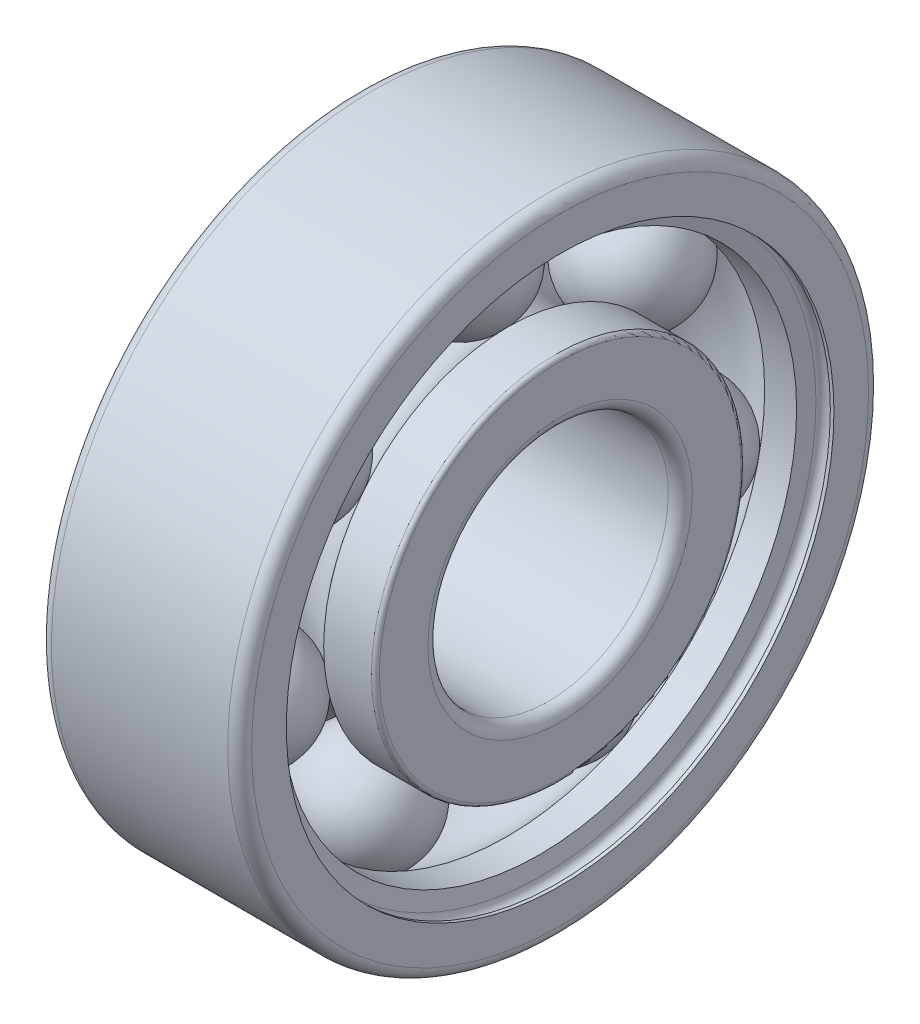
ISO-10303-21;
HEADER;
FILE_DESCRIPTION(('STEP AP214'),'2;1');
FILE_NAME('part.step','',(''),(''),'','','');
FILE_SCHEMA(('AUTOMOTIVE_DESIGN { 1 0 10303 214 1 1 1 1 }'));
ENDSEC;
DATA;
#1=APPLICATION_CONTEXT('core data for automotive mechanical design processes');
#2=APPLICATION_PROTOCOL_DEFINITION('international standard','automotive_design',2000,#1);
#3=PRODUCT_CONTEXT('',#1,'mechanical');
#4=PRODUCT('Part','Part','',(#3));
#5=PRODUCT_RELATED_PRODUCT_CATEGORY('part','',(#4));
#6=PRODUCT_DEFINITION_FORMATION('','',#4);
#7=PRODUCT_DEFINITION_CONTEXT('part definition',#1,'design');
#8=PRODUCT_DEFINITION('design','',#6,#7);
#9=PRODUCT_DEFINITION_SHAPE('','',#8);
#10=(LENGTH_UNIT() NAMED_UNIT(*) SI_UNIT(.MILLI.,.METRE.));
#11=(NAMED_UNIT(*) PLANE_ANGLE_UNIT() SI_UNIT($,.RADIAN.));
#12=(NAMED_UNIT(*) SI_UNIT($,.STERADIAN.) SOLID_ANGLE_UNIT());
#13=UNCERTAINTY_MEASURE_WITH_UNIT(LENGTH_MEASURE(1.E-05),#10,'distance_accuracy_value','');
#14=(GEOMETRIC_REPRESENTATION_CONTEXT(3) GLOBAL_UNCERTAINTY_ASSIGNED_CONTEXT((#13)) GLOBAL_UNIT_ASSIGNED_CONTEXT((#10,
#11,#12)) REPRESENTATION_CONTEXT('',''));
#15=CARTESIAN_POINT('',(0.,0.,0.));
#16=DIRECTION('',(0.,0.,1.));
#17=DIRECTION('',(1.,0.,0.));
#18=AXIS2_PLACEMENT_3D('',#15,#16,#17);
#19=CARTESIAN_POINT('',(0.,15.4000000000003,0.));
#20=DIRECTION('',(-1.,0.,0.));
#21=DIRECTION('',(0.,0.,1.));
#22=AXIS2_PLACEMENT_3D('',#19,#20,#21);
#23=PLANE('',#22);
#24=CARTESIAN_POINT('',(0.,0.,0.));
#25=DIRECTION('',(1.,0.,0.));
#26=DIRECTION('',(0.,0.,-1.));
#27=AXIS2_PLACEMENT_3D('',#24,#25,#26);
#28=CIRCLE('',#27,13.67);
#29=CARTESIAN_POINT('',(0.,0.,-13.67));
#30=VERTEX_POINT('',#29);
#31=EDGE_CURVE('P0_E10',#30,#30,#28,.T.);
#32=ORIENTED_EDGE('',*,*,#31,.T.);
#33=EDGE_LOOP('',(#32));
#34=FACE_BOUND('',#33,.T.);
#35=CARTESIAN_POINT('',(0.,0.,0.));
#36=DIRECTION('',(1.,0.,0.));
#37=DIRECTION('',(0.,0.,-1.));
#38=AXIS2_PLACEMENT_3D('',#35,#36,#37);
#39=CIRCLE('',#38,15.4);
#40=CARTESIAN_POINT('',(0.,0.,-15.4));
#41=VERTEX_POINT('',#40);
#42=EDGE_CURVE('P0_E60',#41,#41,#39,.T.);
#43=ORIENTED_EDGE('',*,*,#42,.F.);
#44=EDGE_LOOP('',(#43));
#45=FACE_BOUND('',#44,.T.);
#46=ADVANCED_FACE('P0_F14',(#34,#45),#23,.T.);
#47=CARTESIAN_POINT('',(50.,0.,1.66533453693773E-13));
#48=DIRECTION('',(1.,0.,0.));
#49=DIRECTION('',(0.,0.,-1.));
#50=AXIS2_PLACEMENT_3D('',#47,#48,#49);
#51=CYLINDRICAL_SURFACE('',#50,13.67);
#52=CARTESIAN_POINT('',(0.180000000000013,0.,0.));
#53=DIRECTION('',(1.,0.,0.));
#54=DIRECTION('',(0.,0.,-1.));
#55=AXIS2_PLACEMENT_3D('',#52,#53,#54);
#56=CIRCLE('',#55,13.67);
#57=CARTESIAN_POINT('',(0.180000000000013,0.,-13.67));
#58=VERTEX_POINT('',#57);
#59=EDGE_CURVE('P0_E20',#58,#58,#56,.T.);
#60=ORIENTED_EDGE('',*,*,#59,.T.);
#61=EDGE_LOOP('',(#60));
#62=FACE_BOUND('',#61,.T.);
#63=ORIENTED_EDGE('',*,*,#31,.F.);
#64=EDGE_LOOP('',(#63));
#65=FACE_BOUND('',#64,.T.);
#66=ADVANCED_FACE('P0_F68',(#62,#65),#51,.F.);
#67=CARTESIAN_POINT('',(0.540000000000013,0.,0.));
#68=DIRECTION('',(1.,0.,0.));
#69=DIRECTION('',(0.,0.,-1.));
#70=AXIS2_PLACEMENT_3D('',#67,#68,#69);
#71=TOROIDAL_SURFACE('',#70,13.67,0.359999999999999);
#72=ORIENTED_EDGE('',*,*,#59,.F.);
#73=EDGE_LOOP('',(#72));
#74=FACE_BOUND('',#73,.T.);
#75=CARTESIAN_POINT('',(0.900000000000012,0.,0.));
#76=DIRECTION('',(1.,0.,0.));
#77=DIRECTION('',(0.,0.,-1.));
#78=AXIS2_PLACEMENT_3D('',#75,#76,#77);
#79=CIRCLE('',#78,13.67);
#80=CARTESIAN_POINT('',(0.900000000000011,0.,-13.67));
#81=VERTEX_POINT('',#80);
#82=EDGE_CURVE('P0_E24',#81,#81,#79,.T.);
#83=ORIENTED_EDGE('',*,*,#82,.T.);
#84=EDGE_LOOP('',(#83));
#85=FACE_BOUND('',#84,.T.);
#86=ADVANCED_FACE('P0_F74',(#74,#85),#71,.F.);
#87=CARTESIAN_POINT('',(0.900000000000012,0.,0.));
#88=DIRECTION('',(-1.,0.,0.));
#89=DIRECTION('',(0.,0.,1.));
#90=AXIS2_PLACEMENT_3D('',#87,#88,#89);
#91=CONICAL_SURFACE('',#90,13.67,1.39626340159546);
#92=CARTESIAN_POINT('',(1.04458812418096,0.,0.));
#93=DIRECTION('',(1.,0.,0.));
#94=DIRECTION('',(0.,0.,-1.));
#95=AXIS2_PLACEMENT_3D('',#92,#93,#94);
#96=CIRCLE('',#95,12.85);
#97=CARTESIAN_POINT('',(1.04458812418096,0.,-12.85));
#98=VERTEX_POINT('',#97);
#99=EDGE_CURVE('P0_E28',#98,#98,#96,.T.);
#100=ORIENTED_EDGE('',*,*,#99,.T.);
#101=EDGE_LOOP('',(#100));
#102=FACE_BOUND('',#101,.T.);
#103=ORIENTED_EDGE('',*,*,#82,.F.);
#104=EDGE_LOOP('',(#103));
#105=FACE_BOUND('',#104,.T.);
#106=ADVANCED_FACE('P0_F79',(#102,#105),#91,.F.);
#107=CARTESIAN_POINT('',(50.,0.,1.66533453693773E-13));
#108=DIRECTION('',(1.,0.,0.));
#109=DIRECTION('',(0.,0.,-1.));
#110=AXIS2_PLACEMENT_3D('',#107,#108,#109);
#111=CYLINDRICAL_SURFACE('',#110,12.85);
#112=CARTESIAN_POINT('',(2.63832686427609,0.,0.));
#113=DIRECTION('',(1.,0.,0.));
#114=DIRECTION('',(0.,0.,-1.));
#115=AXIS2_PLACEMENT_3D('',#112,#113,#114);
#116=CIRCLE('',#115,12.85);
#117=CARTESIAN_POINT('',(2.63832686427609,0.,-12.85));
#118=VERTEX_POINT('',#117);
#119=EDGE_CURVE('P0_E33',#118,#118,#116,.T.);
#120=ORIENTED_EDGE('',*,*,#119,.T.);
#121=EDGE_LOOP('',(#120));
#122=FACE_BOUND('',#121,.T.);
#123=ORIENTED_EDGE('',*,*,#99,.F.);
#124=EDGE_LOOP('',(#123));
#125=FACE_BOUND('',#124,.T.);
#126=ADVANCED_FACE('P0_F86',(#122,#125),#111,.F.);
#127=CARTESIAN_POINT('',(5.,0.,0.));
#128=DIRECTION('',(1.,0.,0.));
#129=DIRECTION('',(0.,0.,-1.));
#130=AXIS2_PLACEMENT_3D('',#127,#128,#129);
#131=TOROIDAL_SURFACE('',#130,11.,3.);
#132=ORIENTED_EDGE('',*,*,#119,.F.);
#133=EDGE_LOOP('',(#132));
#134=FACE_BOUND('',#133,.T.);
#135=CARTESIAN_POINT('',(7.36167313572392,0.,0.));
#136=DIRECTION('',(1.,0.,0.));
#137=DIRECTION('',(0.,0.,-1.));
#138=AXIS2_PLACEMENT_3D('',#135,#136,#137);
#139=CIRCLE('',#138,12.85);
#140=CARTESIAN_POINT('',(7.36167313572392,0.,-12.85));
#141=VERTEX_POINT('',#140);
#142=EDGE_CURVE('P0_E36',#141,#141,#139,.T.);
#143=ORIENTED_EDGE('',*,*,#142,.T.);
#144=EDGE_LOOP('',(#143));
#145=FACE_BOUND('',#144,.T.);
#146=ADVANCED_FACE('P0_F90',(#134,#145),#131,.F.);
#147=CARTESIAN_POINT('',(50.,0.,1.66533453693773E-13));
#148=DIRECTION('',(1.,0.,0.));
#149=DIRECTION('',(0.,0.,-1.));
#150=AXIS2_PLACEMENT_3D('',#147,#148,#149);
#151=CYLINDRICAL_SURFACE('',#150,12.85);
#152=CARTESIAN_POINT('',(8.95541187581905,0.,0.));
#153=DIRECTION('',(1.,0.,0.));
#154=DIRECTION('',(0.,0.,-1.));
#155=AXIS2_PLACEMENT_3D('',#152,#153,#154);
#156=CIRCLE('',#155,12.85);
#157=CARTESIAN_POINT('',(8.95541187581905,0.,-12.85));
#158=VERTEX_POINT('',#157);
#159=EDGE_CURVE('P0_E39',#158,#158,#156,.T.);
#160=ORIENTED_EDGE('',*,*,#159,.T.);
#161=EDGE_LOOP('',(#160));
#162=FACE_BOUND('',#161,.T.);
#163=ORIENTED_EDGE('',*,*,#142,.F.);
#164=EDGE_LOOP('',(#163));
#165=FACE_BOUND('',#164,.T.);
#166=ADVANCED_FACE('P0_F94',(#162,#165),#151,.F.);
#167=CARTESIAN_POINT('',(8.95541187581905,0.,0.));
#168=DIRECTION('',(1.,0.,0.));
#169=DIRECTION('',(0.,0.,-1.));
#170=AXIS2_PLACEMENT_3D('',#167,#168,#169);
#171=CONICAL_SURFACE('',#170,12.85,1.39626340159547);
#172=CARTESIAN_POINT('',(9.1,0.,0.));
#173=DIRECTION('',(1.,0.,0.));
#174=DIRECTION('',(0.,0.,-1.));
#175=AXIS2_PLACEMENT_3D('',#172,#173,#174);
#176=CIRCLE('',#175,13.67);
#177=CARTESIAN_POINT('',(9.1,0.,-13.67));
#178=VERTEX_POINT('',#177);
#179=EDGE_CURVE('P0_E42',#178,#178,#176,.T.);
#180=ORIENTED_EDGE('',*,*,#179,.T.);
#181=EDGE_LOOP('',(#180));
#182=FACE_BOUND('',#181,.T.);
#183=ORIENTED_EDGE('',*,*,#159,.F.);
#184=EDGE_LOOP('',(#183));
#185=FACE_BOUND('',#184,.T.);
#186=ADVANCED_FACE('P0_F98',(#182,#185),#171,.F.);
#187=CARTESIAN_POINT('',(9.46,0.,0.));
#188=DIRECTION('',(1.,0.,0.));
#189=DIRECTION('',(0.,0.,-1.));
#190=AXIS2_PLACEMENT_3D('',#187,#188,#189);
#191=TOROIDAL_SURFACE('',#190,13.6700000189953,0.36);
#192=ORIENTED_EDGE('',*,*,#179,.F.);
#193=EDGE_LOOP('',(#192));
#194=FACE_BOUND('',#193,.T.);
#195=CARTESIAN_POINT('',(9.8199999999995,0.,0.));
#196=DIRECTION('',(1.,0.,0.));
#197=DIRECTION('',(0.,0.,-1.));
#198=AXIS2_PLACEMENT_3D('',#195,#196,#197);
#199=CIRCLE('',#198,13.670000627242);
#200=CARTESIAN_POINT('',(9.8199999999995,0.,-13.670000627242));
#201=VERTEX_POINT('',#200);
#202=EDGE_CURVE('P0_E45',#201,#201,#199,.T.);
#203=ORIENTED_EDGE('',*,*,#202,.T.);
#204=EDGE_LOOP('',(#203));
#205=FACE_BOUND('',#204,.T.);
#206=ADVANCED_FACE('P0_F102',(#194,#205),#191,.F.);
#207=CARTESIAN_POINT('',(50.,0.,1.66533453693773E-13));
#208=DIRECTION('',(1.,0.,0.));
#209=DIRECTION('',(0.,0.,-1.));
#210=AXIS2_PLACEMENT_3D('',#207,#208,#209);
#211=CYLINDRICAL_SURFACE('',#210,13.670000313621);
#212=CARTESIAN_POINT('',(10.,0.,0.));
#213=DIRECTION('',(1.,0.,0.));
#214=DIRECTION('',(0.,0.,-1.));
#215=AXIS2_PLACEMENT_3D('',#212,#213,#214);
#216=CIRCLE('',#215,13.67);
#217=CARTESIAN_POINT('',(10.,0.,-13.67));
#218=VERTEX_POINT('',#217);
#219=EDGE_CURVE('P0_E48',#218,#218,#216,.T.);
#220=ORIENTED_EDGE('',*,*,#219,.T.);
#221=EDGE_LOOP('',(#220));
#222=FACE_BOUND('',#221,.T.);
#223=ORIENTED_EDGE('',*,*,#202,.F.);
#224=EDGE_LOOP('',(#223));
#225=FACE_BOUND('',#224,.T.);
#226=ADVANCED_FACE('P0_F106',(#222,#225),#211,.F.);
#227=CARTESIAN_POINT('',(9.99999999999999,13.6700000000001,4.44089209850063E-13));
#228=DIRECTION('',(1.,0.,0.));
#229=DIRECTION('',(0.,0.,-1.));
#230=AXIS2_PLACEMENT_3D('',#227,#228,#229);
#231=PLANE('',#230);
#232=CARTESIAN_POINT('',(10.,0.,0.));
#233=DIRECTION('',(1.,0.,0.));
#234=DIRECTION('',(0.,0.,-1.));
#235=AXIS2_PLACEMENT_3D('',#232,#233,#234);
#236=CIRCLE('',#235,15.4);
#237=CARTESIAN_POINT('',(10.,0.,-15.4));
#238=VERTEX_POINT('',#237);
#239=EDGE_CURVE('P0_E51',#238,#238,#236,.T.);
#240=ORIENTED_EDGE('',*,*,#239,.T.);
#241=EDGE_LOOP('',(#240));
#242=FACE_BOUND('',#241,.T.);
#243=ORIENTED_EDGE('',*,*,#219,.F.);
#244=EDGE_LOOP('',(#243));
#245=FACE_BOUND('',#244,.T.);
#246=ADVANCED_FACE('P0_F110',(#242,#245),#231,.T.);
#247=CARTESIAN_POINT('',(9.39999999999999,0.,0.));
#248=DIRECTION('',(1.,0.,0.));
#249=DIRECTION('',(0.,0.,-1.));
#250=AXIS2_PLACEMENT_3D('',#247,#248,#249);
#251=TOROIDAL_SURFACE('',#250,15.4,0.600000000000007);
#252=CARTESIAN_POINT('',(9.39999999999999,0.,0.));
#253=DIRECTION('',(1.,0.,0.));
#254=DIRECTION('',(0.,0.,-1.));
#255=AXIS2_PLACEMENT_3D('',#252,#253,#254);
#256=CIRCLE('',#255,16.);
#257=CARTESIAN_POINT('',(9.39999999999999,0.,-16.));
#258=VERTEX_POINT('',#257);
#259=EDGE_CURVE('P0_E54',#258,#258,#256,.T.);
#260=ORIENTED_EDGE('',*,*,#259,.T.);
#261=EDGE_LOOP('',(#260));
#262=FACE_BOUND('',#261,.T.);
#263=ORIENTED_EDGE('',*,*,#239,.F.);
#264=EDGE_LOOP('',(#263));
#265=FACE_BOUND('',#264,.T.);
#266=ADVANCED_FACE('P0_F114',(#262,#265),#251,.T.);
#267=CARTESIAN_POINT('',(50.,0.,1.66533453693773E-13));
#268=DIRECTION('',(1.,0.,0.));
#269=DIRECTION('',(0.,0.,-1.));
#270=AXIS2_PLACEMENT_3D('',#267,#268,#269);
#271=CYLINDRICAL_SURFACE('',#270,16.);
#272=CARTESIAN_POINT('',(0.599999999999989,0.,0.));
#273=DIRECTION('',(1.,0.,0.));
#274=DIRECTION('',(0.,0.,-1.));
#275=AXIS2_PLACEMENT_3D('',#272,#273,#274);
#276=CIRCLE('',#275,16.);
#277=CARTESIAN_POINT('',(0.599999999999989,0.,-16.));
#278=VERTEX_POINT('',#277);
#279=EDGE_CURVE('P0_E57',#278,#278,#276,.T.);
#280=ORIENTED_EDGE('',*,*,#279,.T.);
#281=EDGE_LOOP('',(#280));
#282=FACE_BOUND('',#281,.T.);
#283=ORIENTED_EDGE('',*,*,#259,.F.);
#284=EDGE_LOOP('',(#283));
#285=FACE_BOUND('',#284,.T.);
#286=ADVANCED_FACE('P0_F118',(#282,#285),#271,.T.);
#287=CARTESIAN_POINT('',(0.600000000000017,0.,0.));
#288=DIRECTION('',(1.,0.,0.));
#289=DIRECTION('',(0.,0.,-1.));
#290=AXIS2_PLACEMENT_3D('',#287,#288,#289);
#291=TOROIDAL_SURFACE('',#290,15.4,0.600000000000003);
#292=ORIENTED_EDGE('',*,*,#42,.T.);
#293=EDGE_LOOP('',(#292));
#294=FACE_BOUND('',#293,.T.);
#295=ORIENTED_EDGE('',*,*,#279,.F.);
#296=EDGE_LOOP('',(#295));
#297=FACE_BOUND('',#296,.T.);
#298=ADVANCED_FACE('P0_F64',(#294,#297),#291,.T.);
#299=CLOSED_SHELL('',(#46,#66,#86,#106,#126,#146,#166,#186,#206,#226,#246,#266,#286,#298));
#300=MANIFOLD_SOLID_BREP('P0_B1',#299);
#301=CARTESIAN_POINT('',(50.,0.,1.66533453693773E-13));
#302=DIRECTION('',(1.,0.,0.));
#303=DIRECTION('',(0.,0.,-1.));
#304=AXIS2_PLACEMENT_3D('',#301,#302,#303);
#305=CYLINDRICAL_SURFACE('',#304,9.225);
#306=CARTESIAN_POINT('',(0.200000000000006,0.,0.));
#307=DIRECTION('',(1.,0.,0.));
#308=DIRECTION('',(0.,0.,-1.));
#309=AXIS2_PLACEMENT_3D('',#306,#307,#308);
#310=CIRCLE('',#309,9.225);
#311=CARTESIAN_POINT('',(0.200000000000005,0.,-9.225));
#312=VERTEX_POINT('',#311);
#313=EDGE_CURVE('P1_E49',#312,#312,#310,.T.);
#314=ORIENTED_EDGE('',*,*,#313,.T.);
#315=EDGE_LOOP('',(#314));
#316=FACE_BOUND('',#315,.T.);
#317=CARTESIAN_POINT('',(0.539999999999985,0.,0.));
#318=DIRECTION('',(1.,0.,0.));
#319=DIRECTION('',(0.,0.,-1.));
#320=AXIS2_PLACEMENT_3D('',#317,#318,#319);
#321=CIRCLE('',#320,9.225);
#322=CARTESIAN_POINT('',(0.539999999999984,0.,-9.225));
#323=VERTEX_POINT('',#322);
#324=EDGE_CURVE('P1_E61',#323,#323,#321,.T.);
#325=ORIENTED_EDGE('',*,*,#324,.F.);
#326=EDGE_LOOP('',(#325));
#327=FACE_BOUND('',#326,.T.);
#328=ADVANCED_FACE('P1_F14',(#316,#327),#305,.T.);
#329=CARTESIAN_POINT('',(0.200000000000006,0.,0.));
#330=DIRECTION('',(1.,0.,0.));
#331=DIRECTION('',(0.,0.,-1.));
#332=AXIS2_PLACEMENT_3D('',#329,#330,#331);
#333=TOROIDAL_SURFACE('',#332,9.025,0.200000000000001);
#334=CARTESIAN_POINT('',(0.,0.,0.));
#335=DIRECTION('',(1.,0.,0.));
#336=DIRECTION('',(0.,0.,-1.));
#337=AXIS2_PLACEMENT_3D('',#334,#335,#336);
#338=CIRCLE('',#337,9.025);
#339=CARTESIAN_POINT('',(0.,0.,-9.025));
#340=VERTEX_POINT('',#339);
#341=EDGE_CURVE('P1_E10',#340,#340,#338,.T.);
#342=ORIENTED_EDGE('',*,*,#341,.T.);
#343=EDGE_LOOP('',(#342));
#344=FACE_BOUND('',#343,.T.);
#345=ORIENTED_EDGE('',*,*,#313,.F.);
#346=EDGE_LOOP('',(#345));
#347=FACE_BOUND('',#346,.T.);
#348=ADVANCED_FACE('P1_F16',(#344,#347),#333,.T.);
#349=CARTESIAN_POINT('',(0.,9.02500000000006,0.));
#350=DIRECTION('',(-1.,0.,0.));
#351=DIRECTION('',(0.,0.,1.));
#352=AXIS2_PLACEMENT_3D('',#349,#350,#351);
#353=PLANE('',#352);
#354=CARTESIAN_POINT('',(0.,0.,0.));
#355=DIRECTION('',(1.,0.,0.));
#356=DIRECTION('',(0.,0.,-1.));
#357=AXIS2_PLACEMENT_3D('',#354,#355,#356);
#358=CIRCLE('',#357,6.6);
#359=CARTESIAN_POINT('',(0.,0.,-6.6));
#360=VERTEX_POINT('',#359);
#361=EDGE_CURVE('P1_E21',#360,#360,#358,.T.);
#362=ORIENTED_EDGE('',*,*,#361,.T.);
#363=EDGE_LOOP('',(#362));
#364=FACE_BOUND('',#363,.T.);
#365=ORIENTED_EDGE('',*,*,#341,.F.);
#366=EDGE_LOOP('',(#365));
#367=FACE_BOUND('',#366,.T.);
#368=ADVANCED_FACE('P1_F104',(#364,#367),#353,.T.);
#369=CARTESIAN_POINT('',(0.599999999999989,0.,0.));
#370=DIRECTION('',(1.,0.,0.));
#371=DIRECTION('',(0.,0.,-1.));
#372=AXIS2_PLACEMENT_3D('',#369,#370,#371);
#373=TOROIDAL_SURFACE('',#372,6.6,0.599999999999999);
#374=CARTESIAN_POINT('',(0.599999999999989,0.,0.));
#375=DIRECTION('',(1.,0.,0.));
#376=DIRECTION('',(0.,0.,-1.));
#377=AXIS2_PLACEMENT_3D('',#374,#375,#376);
#378=CIRCLE('',#377,6.);
#379=CARTESIAN_POINT('',(0.599999999999989,0.,-6.));
#380=VERTEX_POINT('',#379);
#381=EDGE_CURVE('P1_E25',#380,#380,#378,.T.);
#382=ORIENTED_EDGE('',*,*,#381,.T.);
#383=EDGE_LOOP('',(#382));
#384=FACE_BOUND('',#383,.T.);
#385=ORIENTED_EDGE('',*,*,#361,.F.);
#386=EDGE_LOOP('',(#385));
#387=FACE_BOUND('',#386,.T.);
#388=ADVANCED_FACE('P1_F129',(#384,#387),#373,.T.);
#389=CARTESIAN_POINT('',(50.,0.,1.66533453693773E-13));
#390=DIRECTION('',(1.,0.,0.));
#391=DIRECTION('',(0.,0.,-1.));
#392=AXIS2_PLACEMENT_3D('',#389,#390,#391);
#393=CYLINDRICAL_SURFACE('',#392,6.);
#394=CARTESIAN_POINT('',(9.39999999999999,0.,0.));
#395=DIRECTION('',(1.,0.,0.));
#396=DIRECTION('',(0.,0.,-1.));
#397=AXIS2_PLACEMENT_3D('',#394,#395,#396);
#398=CIRCLE('',#397,6.);
#399=CARTESIAN_POINT('',(9.39999999999999,0.,-6.));
#400=VERTEX_POINT('',#399);
#401=EDGE_CURVE('P1_E29',#400,#400,#398,.T.);
#402=ORIENTED_EDGE('',*,*,#401,.T.);
#403=EDGE_LOOP('',(#402));
#404=FACE_BOUND('',#403,.T.);
#405=ORIENTED_EDGE('',*,*,#381,.F.);
#406=EDGE_LOOP('',(#405));
#407=FACE_BOUND('',#406,.T.);
#408=ADVANCED_FACE('P1_F125',(#404,#407),#393,.F.);
#409=CARTESIAN_POINT('',(9.39999999999999,0.,0.));
#410=DIRECTION('',(1.,0.,0.));
#411=DIRECTION('',(0.,0.,-1.));
#412=AXIS2_PLACEMENT_3D('',#409,#410,#411);
#413=TOROIDAL_SURFACE('',#412,6.6,0.600000000000003);
#414=CARTESIAN_POINT('',(10.,0.,0.));
#415=DIRECTION('',(1.,0.,0.));
#416=DIRECTION('',(0.,0.,-1.));
#417=AXIS2_PLACEMENT_3D('',#414,#415,#416);
#418=CIRCLE('',#417,6.6);
#419=CARTESIAN_POINT('',(10.,0.,-6.6));
#420=VERTEX_POINT('',#419);
#421=EDGE_CURVE('P1_E34',#420,#420,#418,.T.);
#422=ORIENTED_EDGE('',*,*,#421,.T.);
#423=EDGE_LOOP('',(#422));
#424=FACE_BOUND('',#423,.T.);
#425=ORIENTED_EDGE('',*,*,#401,.F.);
#426=EDGE_LOOP('',(#425));
#427=FACE_BOUND('',#426,.T.);
#428=ADVANCED_FACE('P1_F121',(#424,#427),#413,.T.);
#429=CARTESIAN_POINT('',(10.,6.59999999999994,2.22044604925031E-13));
#430=DIRECTION('',(1.,0.,0.));
#431=DIRECTION('',(0.,0.,-1.));
#432=AXIS2_PLACEMENT_3D('',#429,#430,#431);
#433=PLANE('',#432);
#434=CARTESIAN_POINT('',(10.,0.,0.));
#435=DIRECTION('',(1.,0.,0.));
#436=DIRECTION('',(0.,0.,-1.));
#437=AXIS2_PLACEMENT_3D('',#434,#435,#436);
#438=CIRCLE('',#437,9.025);
#439=CARTESIAN_POINT('',(10.,0.,-9.025));
#440=VERTEX_POINT('',#439);
#441=EDGE_CURVE('P1_E37',#440,#440,#438,.T.);
#442=ORIENTED_EDGE('',*,*,#441,.T.);
#443=EDGE_LOOP('',(#442));
#444=FACE_BOUND('',#443,.T.);
#445=ORIENTED_EDGE('',*,*,#421,.F.);
#446=EDGE_LOOP('',(#445));
#447=FACE_BOUND('',#446,.T.);
#448=ADVANCED_FACE('P1_F117',(#444,#447),#433,.T.);
#449=CARTESIAN_POINT('',(9.8,0.,0.));
#450=DIRECTION('',(1.,0.,0.));
#451=DIRECTION('',(0.,0.,-1.));
#452=AXIS2_PLACEMENT_3D('',#449,#450,#451);
#453=TOROIDAL_SURFACE('',#452,9.025,0.200000000000001);
#454=CARTESIAN_POINT('',(9.8,0.,0.));
#455=DIRECTION('',(1.,0.,0.));
#456=DIRECTION('',(0.,0.,-1.));
#457=AXIS2_PLACEMENT_3D('',#454,#455,#456);
#458=CIRCLE('',#457,9.225);
#459=CARTESIAN_POINT('',(9.8,0.,-9.225));
#460=VERTEX_POINT('',#459);
#461=EDGE_CURVE('P1_E40',#460,#460,#458,.T.);
#462=ORIENTED_EDGE('',*,*,#461,.T.);
#463=EDGE_LOOP('',(#462));
#464=FACE_BOUND('',#463,.T.);
#465=ORIENTED_EDGE('',*,*,#441,.F.);
#466=EDGE_LOOP('',(#465));
#467=FACE_BOUND('',#466,.T.);
#468=ADVANCED_FACE('P1_F113',(#464,#467),#453,.T.);
#469=CARTESIAN_POINT('',(50.,0.,1.66533453693773E-13));
#470=DIRECTION('',(1.,0.,0.));
#471=DIRECTION('',(0.,0.,-1.));
#472=AXIS2_PLACEMENT_3D('',#469,#470,#471);
#473=CYLINDRICAL_SURFACE('',#472,9.225);
#474=CARTESIAN_POINT('',(7.41854811818993,0.,0.));
#475=DIRECTION('',(1.,0.,0.));
#476=DIRECTION('',(0.,0.,-1.));
#477=AXIS2_PLACEMENT_3D('',#474,#475,#476);
#478=CIRCLE('',#477,9.225);
#479=CARTESIAN_POINT('',(7.41854811818993,0.,-9.225));
#480=VERTEX_POINT('',#479);
#481=EDGE_CURVE('P1_E43',#480,#480,#478,.T.);
#482=ORIENTED_EDGE('',*,*,#481,.T.);
#483=EDGE_LOOP('',(#482));
#484=FACE_BOUND('',#483,.T.);
#485=ORIENTED_EDGE('',*,*,#461,.F.);
#486=EDGE_LOOP('',(#485));
#487=FACE_BOUND('',#486,.T.);
#488=ADVANCED_FACE('P1_F109',(#484,#487),#473,.T.);
#489=CARTESIAN_POINT('',(5.,0.,0.));
#490=DIRECTION('',(1.,0.,0.));
#491=DIRECTION('',(0.,0.,-1.));
#492=AXIS2_PLACEMENT_3D('',#489,#490,#491);
#493=TOROIDAL_SURFACE('',#492,11.,3.);
#494=ORIENTED_EDGE('',*,*,#481,.F.);
#495=EDGE_LOOP('',(#494));
#496=FACE_BOUND('',#495,.T.);
#497=CARTESIAN_POINT('',(2.58145188181008,0.,0.));
#498=DIRECTION('',(1.,0.,0.));
#499=DIRECTION('',(0.,0.,-1.));
#500=AXIS2_PLACEMENT_3D('',#497,#498,#499);
#501=CIRCLE('',#500,9.225);
#502=CARTESIAN_POINT('',(2.58145188181008,0.,-9.225));
#503=VERTEX_POINT('',#502);
#504=EDGE_CURVE('P1_E46',#503,#503,#501,.T.);
#505=ORIENTED_EDGE('',*,*,#504,.T.);
#506=EDGE_LOOP('',(#505));
#507=FACE_BOUND('',#506,.T.);
#508=ADVANCED_FACE('P1_F95',(#496,#507),#493,.F.);
#509=CARTESIAN_POINT('',(0.719999999999998,0.,0.));
#510=DIRECTION('',(1.,0.,0.));
#511=DIRECTION('',(0.,0.,-1.));
#512=AXIS2_PLACEMENT_3D('',#509,#510,#511);
#513=CIRCLE('',#512,9.225);
#514=CARTESIAN_POINT('',(0.719999999999998,0.,-9.225));
#515=VERTEX_POINT('',#514);
#516=EDGE_CURVE('P1_E64',#515,#515,#513,.T.);
#517=ORIENTED_EDGE('',*,*,#516,.T.);
#518=EDGE_LOOP('',(#517));
#519=FACE_BOUND('',#518,.T.);
#520=ORIENTED_EDGE('',*,*,#504,.F.);
#521=EDGE_LOOP('',(#520));
#522=FACE_BOUND('',#521,.T.);
#523=ADVANCED_FACE('P1_F83',(#519,#522),#305,.T.);
#524=CARTESIAN_POINT('',(50.,0.,1.66533453693773E-13));
#525=DIRECTION('',(1.,0.,0.));
#526=DIRECTION('',(0.,0.,-1.));
#527=AXIS2_PLACEMENT_3D('',#524,#525,#526);
#528=CYLINDRICAL_SURFACE('',#527,13.67);
#529=CARTESIAN_POINT('',(0.539999999999985,0.,0.));
#530=DIRECTION('',(1.,0.,0.));
#531=DIRECTION('',(0.,0.,-1.));
#532=AXIS2_PLACEMENT_3D('',#529,#530,#531);
#533=CIRCLE('',#532,13.67);
#534=CARTESIAN_POINT('',(0.539999999999984,0.,-13.67));
#535=VERTEX_POINT('',#534);
#536=EDGE_CURVE('P1_E52',#535,#535,#533,.T.);
#537=ORIENTED_EDGE('',*,*,#536,.T.);
#538=EDGE_LOOP('',(#537));
#539=FACE_BOUND('',#538,.T.);
#540=CARTESIAN_POINT('',(0.719999999999998,0.,0.));
#541=DIRECTION('',(1.,0.,0.));
#542=DIRECTION('',(0.,0.,-1.));
#543=AXIS2_PLACEMENT_3D('',#540,#541,#542);
#544=CIRCLE('',#543,13.67);
#545=CARTESIAN_POINT('',(0.719999999999998,0.,-13.67));
#546=VERTEX_POINT('',#545);
#547=EDGE_CURVE('P1_E73',#546,#546,#544,.T.);
#548=ORIENTED_EDGE('',*,*,#547,.F.);
#549=EDGE_LOOP('',(#548));
#550=FACE_BOUND('',#549,.T.);
#551=ADVANCED_FACE('P1_F80',(#539,#550),#528,.T.);
#552=CARTESIAN_POINT('',(0.539999999999985,0.,0.));
#553=DIRECTION('',(-1.,0.,0.));
#554=DIRECTION('',(0.,0.,1.));
#555=AXIS2_PLACEMENT_3D('',#552,#553,#554);
#556=CONICAL_SURFACE('',#555,13.67,1.4899828374434);
#557=CARTESIAN_POINT('',(0.629999999999992,0.,0.));
#558=DIRECTION('',(1.,0.,0.));
#559=DIRECTION('',(0.,0.,-1.));
#560=AXIS2_PLACEMENT_3D('',#557,#558,#559);
#561=CIRCLE('',#560,12.55875);
#562=CARTESIAN_POINT('',(0.629999999999991,0.,-12.55875));
#563=VERTEX_POINT('',#562);
#564=EDGE_CURVE('P1_E55',#563,#563,#561,.T.);
#565=ORIENTED_EDGE('',*,*,#564,.T.);
#566=EDGE_LOOP('',(#565));
#567=FACE_BOUND('',#566,.T.);
#568=ORIENTED_EDGE('',*,*,#536,.F.);
#569=EDGE_LOOP('',(#568));
#570=FACE_BOUND('',#569,.T.);
#571=ADVANCED_FACE('P1_F82',(#567,#570),#556,.F.);
#572=CARTESIAN_POINT('',(0.629999999999992,0.,0.));
#573=DIRECTION('',(1.,0.,0.));
#574=DIRECTION('',(0.,0.,-1.));
#575=AXIS2_PLACEMENT_3D('',#572,#573,#574);
#576=CONICAL_SURFACE('',#575,12.55875,1.4899828374434);
#577=CARTESIAN_POINT('',(0.539999999999985,0.,0.));
#578=DIRECTION('',(1.,0.,0.));
#579=DIRECTION('',(0.,0.,-1.));
#580=AXIS2_PLACEMENT_3D('',#577,#578,#579);
#581=CIRCLE('',#580,11.4475);
#582=CARTESIAN_POINT('',(0.539999999999984,0.,-11.4475));
#583=VERTEX_POINT('',#582);
#584=EDGE_CURVE('P1_E58',#583,#583,#581,.T.);
#585=ORIENTED_EDGE('',*,*,#584,.T.);
#586=EDGE_LOOP('',(#585));
#587=FACE_BOUND('',#586,.T.);
#588=ORIENTED_EDGE('',*,*,#564,.F.);
#589=EDGE_LOOP('',(#588));
#590=FACE_BOUND('',#589,.T.);
#591=ADVANCED_FACE('P1_F92',(#587,#590),#576,.T.);
#592=CARTESIAN_POINT('',(0.540000000000013,11.4475000000001,2.77555756156289E-13));
#593=DIRECTION('',(-1.,0.,0.));
#594=DIRECTION('',(0.,0.,1.));
#595=AXIS2_PLACEMENT_3D('',#592,#593,#594);
#596=PLANE('',#595);
#597=ORIENTED_EDGE('',*,*,#324,.T.);
#598=EDGE_LOOP('',(#597));
#599=FACE_BOUND('',#598,.T.);
#600=ORIENTED_EDGE('',*,*,#584,.F.);
#601=EDGE_LOOP('',(#600));
#602=FACE_BOUND('',#601,.T.);
#603=ADVANCED_FACE('P1_F220',(#599,#602),#596,.T.);
#604=CARTESIAN_POINT('',(0.719999999999998,0.,0.));
#605=DIRECTION('',(1.,0.,0.));
#606=DIRECTION('',(0.,0.,-1.));
#607=AXIS2_PLACEMENT_3D('',#604,#605,#606);
#608=CONICAL_SURFACE('',#607,9.225,1.4899828374434);
#609=CARTESIAN_POINT('',(0.900000000000012,0.,0.));
#610=DIRECTION('',(1.,0.,0.));
#611=DIRECTION('',(0.,0.,-1.));
#612=AXIS2_PLACEMENT_3D('',#609,#610,#611);
#613=CIRCLE('',#612,11.4475);
#614=CARTESIAN_POINT('',(0.900000000000011,0.,-11.4475));
#615=VERTEX_POINT('',#614);
#616=EDGE_CURVE('P1_E67',#615,#615,#613,.T.);
#617=ORIENTED_EDGE('',*,*,#616,.T.);
#618=EDGE_LOOP('',(#617));
#619=FACE_BOUND('',#618,.T.);
#620=ORIENTED_EDGE('',*,*,#516,.F.);
#621=EDGE_LOOP('',(#620));
#622=FACE_BOUND('',#621,.T.);
#623=ADVANCED_FACE('P1_F228',(#619,#622),#608,.F.);
#624=CARTESIAN_POINT('',(0.900000000000012,11.4475000000001,2.77555756156289E-13));
#625=DIRECTION('',(1.,0.,0.));
#626=DIRECTION('',(0.,0.,-1.));
#627=AXIS2_PLACEMENT_3D('',#624,#625,#626);
#628=PLANE('',#627);
#629=CARTESIAN_POINT('',(0.900000000000012,0.,0.));
#630=DIRECTION('',(1.,0.,0.));
#631=DIRECTION('',(0.,0.,-1.));
#632=AXIS2_PLACEMENT_3D('',#629,#630,#631);
#633=CIRCLE('',#632,12.55875);
#634=CARTESIAN_POINT('',(0.900000000000011,0.,-12.55875));
#635=VERTEX_POINT('',#634);
#636=EDGE_CURVE('P1_E70',#635,#635,#633,.T.);
#637=ORIENTED_EDGE('',*,*,#636,.T.);
#638=EDGE_LOOP('',(#637));
#639=FACE_BOUND('',#638,.T.);
#640=ORIENTED_EDGE('',*,*,#616,.F.);
#641=EDGE_LOOP('',(#640));
#642=FACE_BOUND('',#641,.T.);
#643=ADVANCED_FACE('P1_F237',(#639,#642),#628,.T.);
#644=CARTESIAN_POINT('',(0.900000000000012,0.,0.));
#645=DIRECTION('',(-1.,0.,0.));
#646=DIRECTION('',(0.,0.,1.));
#647=AXIS2_PLACEMENT_3D('',#644,#645,#646);
#648=CONICAL_SURFACE('',#647,12.55875,1.41021132708019);
#649=ORIENTED_EDGE('',*,*,#547,.T.);
#650=EDGE_LOOP('',(#649));
#651=FACE_BOUND('',#650,.T.);
#652=ORIENTED_EDGE('',*,*,#636,.F.);
#653=EDGE_LOOP('',(#652));
#654=FACE_BOUND('',#653,.T.);
#655=ADVANCED_FACE('P1_F77',(#651,#654),#648,.T.);
#656=CLOSED_SHELL('',(#328,#348,#368,#388,#408,#428,#448,#468,#488,#508,#523,#551,#571,#591,
#603,#623,#643,#655));
#657=MANIFOLD_SOLID_BREP('P1_B1',#656);
#658=CARTESIAN_POINT('',(5.,6.85838782044578,-8.60014630714886));
#659=DIRECTION('',(1.,0.,0.));
#660=DIRECTION('',(0.,-0.623489801858734,0.781831482468031));
#661=AXIS2_PLACEMENT_3D('',#658,#659,#660);
#662=SPHERICAL_SURFACE('',#661,3.);
#663=CARTESIAN_POINT('',(8.00000000000001,6.85838782044578,-8.60014630714886));
#664=VERTEX_POINT('',#663);
#665=VERTEX_LOOP('',#664);
#666=FACE_BOUND('',#665,.T.);
#667=ADVANCED_FACE('P2_F12',(#666),#662,.T.);
#668=CLOSED_SHELL('',(#667));
#669=MANIFOLD_SOLID_BREP('P2_B1',#668);
#670=CARTESIAN_POINT('',(5.,-9.91065754692658,4.77272113029374));
#671=DIRECTION('',(1.,0.,0.));
#672=DIRECTION('',(0.,0.90096886790242,-0.433883739117559));
#673=AXIS2_PLACEMENT_3D('',#670,#671,#672);
#674=SPHERICAL_SURFACE('',#673,3.);
#675=CARTESIAN_POINT('',(8.00000000000001,-9.91065754692658,4.77272113029374));
#676=VERTEX_POINT('',#675);
#677=VERTEX_LOOP('',#676);
#678=FACE_BOUND('',#677,.T.);
#679=ADVANCED_FACE('P3_F12',(#678),#674,.T.);
#680=CLOSED_SHELL('',(#679));
#681=MANIFOLD_SOLID_BREP('P3_B1',#680);
#682=CARTESIAN_POINT('',(5.,-2.44773027351896,10.7242070340004));
#683=DIRECTION('',(1.,0.,0.));
#684=DIRECTION('',(0.,0.222520933956314,-0.974927912181825));
#685=AXIS2_PLACEMENT_3D('',#682,#683,#684);
#686=SPHERICAL_SURFACE('',#685,3.);
#687=CARTESIAN_POINT('',(8.00000000000001,-2.44773027351896,10.7242070340004));
#688=VERTEX_POINT('',#687);
#689=VERTEX_LOOP('',#688);
#690=FACE_BOUND('',#689,.T.);
#691=ADVANCED_FACE('P4_F12',(#690),#686,.T.);
#692=CLOSED_SHELL('',(#691));
#693=MANIFOLD_SOLID_BREP('P4_B1',#692);
#694=CARTESIAN_POINT('',(5.,11.0000000000002,-5.55111512312578E-13));
#695=DIRECTION('',(1.,0.,0.));
#696=DIRECTION('',(0.,-1.,0.));
#697=AXIS2_PLACEMENT_3D('',#694,#695,#696);
#698=SPHERICAL_SURFACE('',#697,3.);
#699=CARTESIAN_POINT('',(8.00000000000001,11.0000000000002,-5.55111512312578E-13));
#700=VERTEX_POINT('',#699);
#701=VERTEX_LOOP('',#700);
#702=FACE_BOUND('',#701,.T.);
#703=ADVANCED_FACE('P5_F12',(#702),#698,.T.);
#704=CLOSED_SHELL('',(#703));
#705=MANIFOLD_SOLID_BREP('P5_B1',#704);
#706=CARTESIAN_POINT('',(5.,6.85838782044665,8.60014630714816));
#707=DIRECTION('',(1.,0.,0.));
#708=DIRECTION('',(0.,-0.623489801858734,-0.781831482468031));
#709=AXIS2_PLACEMENT_3D('',#706,#707,#708);
#710=SPHERICAL_SURFACE('',#709,3.);
#711=CARTESIAN_POINT('',(8.00000000000001,6.85838782044665,8.60014630714816));
#712=VERTEX_POINT('',#711);
#713=VERTEX_LOOP('',#712);
#714=FACE_BOUND('',#713,.T.);
#715=ADVANCED_FACE('P6_F12',(#714),#710,.T.);
#716=CLOSED_SHELL('',(#715));
#717=MANIFOLD_SOLID_BREP('P6_B1',#716);
#718=CARTESIAN_POINT('',(5.,-2.44773027352005,-10.7242070340002));
#719=DIRECTION('',(1.,0.,0.));
#720=DIRECTION('',(0.,0.222520933956315,0.974927912181825));
#721=AXIS2_PLACEMENT_3D('',#718,#719,#720);
#722=SPHERICAL_SURFACE('',#721,3.);
#723=CARTESIAN_POINT('',(8.00000000000001,-2.44773027352005,-10.7242070340002));
#724=VERTEX_POINT('',#723);
#725=VERTEX_LOOP('',#724);
#726=FACE_BOUND('',#725,.T.);
#727=ADVANCED_FACE('P7_F12',(#726),#722,.T.);
#728=CLOSED_SHELL('',(#727));
#729=MANIFOLD_SOLID_BREP('P7_B1',#728);
#730=CARTESIAN_POINT('',(5.,-9.91065754692706,-4.77272113029274));
#731=DIRECTION('',(1.,0.,0.));
#732=DIRECTION('',(0.,0.90096886790242,0.433883739117559));
#733=AXIS2_PLACEMENT_3D('',#730,#731,#732);
#734=SPHERICAL_SURFACE('',#733,3.);
#735=CARTESIAN_POINT('',(8.00000000000001,-9.91065754692706,-4.77272113029274));
#736=VERTEX_POINT('',#735);
#737=VERTEX_LOOP('',#736);
#738=FACE_BOUND('',#737,.T.);
#739=ADVANCED_FACE('P8_F12',(#738),#734,.T.);
#740=CLOSED_SHELL('',(#739));
#741=MANIFOLD_SOLID_BREP('P8_B1',#740);
#742=ADVANCED_BREP_SHAPE_REPRESENTATION('',(#18,#300,#657,#669,#681,#693,#705,#717,#729,#741),#14);
#743=SHAPE_DEFINITION_REPRESENTATION(#9,#742);
ENDSEC;
END-ISO-10303-21;
